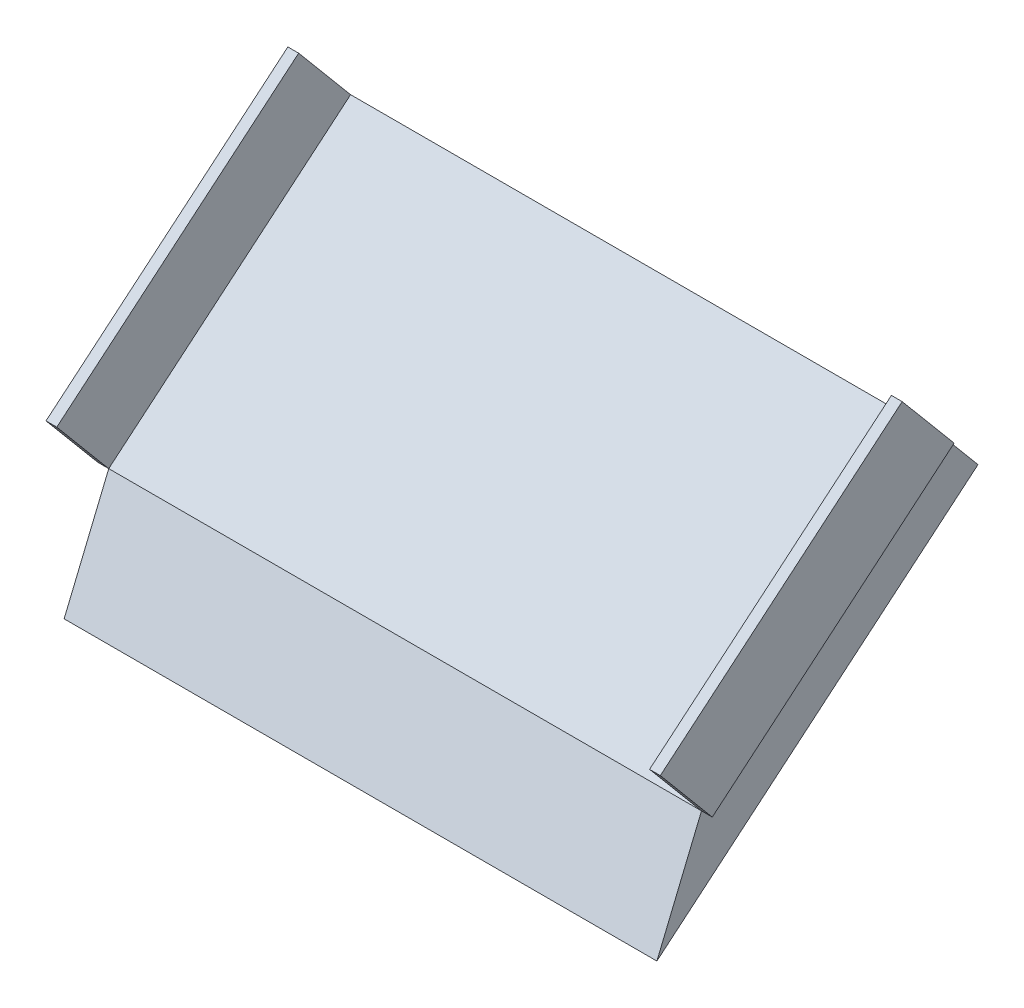
ISO-10303-21;
HEADER;
FILE_DESCRIPTION(('STEP AP214'),'2;1');
FILE_NAME('part.step','',(''),(''),'','','');
FILE_SCHEMA(('AUTOMOTIVE_DESIGN { 1 0 10303 214 1 1 1 1 }'));
ENDSEC;
DATA;
#1=APPLICATION_CONTEXT('core data for automotive mechanical design processes');
#2=APPLICATION_PROTOCOL_DEFINITION('international standard','automotive_design',2000,#1);
#3=PRODUCT_CONTEXT('',#1,'mechanical');
#4=PRODUCT('Part','Part','',(#3));
#5=PRODUCT_RELATED_PRODUCT_CATEGORY('part','',(#4));
#6=PRODUCT_DEFINITION_FORMATION('','',#4);
#7=PRODUCT_DEFINITION_CONTEXT('part definition',#1,'design');
#8=PRODUCT_DEFINITION('design','',#6,#7);
#9=PRODUCT_DEFINITION_SHAPE('','',#8);
#10=(LENGTH_UNIT() NAMED_UNIT(*) SI_UNIT(.MILLI.,.METRE.));
#11=(NAMED_UNIT(*) PLANE_ANGLE_UNIT() SI_UNIT($,.RADIAN.));
#12=(NAMED_UNIT(*) SI_UNIT($,.STERADIAN.) SOLID_ANGLE_UNIT());
#13=UNCERTAINTY_MEASURE_WITH_UNIT(LENGTH_MEASURE(1.E-05),#10,'distance_accuracy_value','');
#14=(GEOMETRIC_REPRESENTATION_CONTEXT(3) GLOBAL_UNCERTAINTY_ASSIGNED_CONTEXT((#13)) GLOBAL_UNIT_ASSIGNED_CONTEXT((#10,
#11,#12)) REPRESENTATION_CONTEXT('',''));
#15=CARTESIAN_POINT('',(0.,0.,0.));
#16=DIRECTION('',(0.,0.,1.));
#17=DIRECTION('',(1.,0.,0.));
#18=AXIS2_PLACEMENT_3D('',#15,#16,#17);
#19=CARTESIAN_POINT('',(-20.,-300.,513.09846046431));
#20=DIRECTION('',(0.,0.766044443118982,0.642787609686535));
#21=DIRECTION('',(0.,-0.642787609686535,0.766044443118982));
#22=AXIS2_PLACEMENT_3D('',#19,#20,#21);
#23=PLANE('',#22);
#24=DIRECTION('',(0.,-0.642787609686535,0.766044443118982));
#25=VECTOR('',#24,1.);
#26=CARTESIAN_POINT('',(0.,-300.,513.09846046431));
#27=LINE('',#26,#25);
#28=CARTESIAN_POINT('',(0.,76.6044443118982,64.2787609686535));
#29=VERTEX_POINT('',#28);
#30=CARTESIAN_POINT('',(0.,-300.,513.09846046431));
#31=VERTEX_POINT('',#30);
#32=EDGE_CURVE('E109',#29,#31,#27,.T.);
#33=ORIENTED_EDGE('',*,*,#32,.T.);
#34=DIRECTION('',(1.,0.,0.));
#35=VECTOR('',#34,1.);
#36=CARTESIAN_POINT('',(-20.,-300.,513.09846046431));
#37=LINE('',#36,#35);
#38=CARTESIAN_POINT('',(-20.,-300.,513.09846046431));
#39=VERTEX_POINT('',#38);
#40=EDGE_CURVE('E12',#39,#31,#37,.T.);
#41=ORIENTED_EDGE('',*,*,#40,.F.);
#42=DIRECTION('',(0.,-0.642787609686535,0.766044443118982));
#43=VECTOR('',#42,1.);
#44=CARTESIAN_POINT('',(-20.,-300.,513.09846046431));
#45=LINE('',#44,#43);
#46=CARTESIAN_POINT('',(-20.,76.6044443118982,64.2787609686535));
#47=VERTEX_POINT('',#46);
#48=EDGE_CURVE('E97',#47,#39,#45,.T.);
#49=ORIENTED_EDGE('',*,*,#48,.F.);
#50=DIRECTION('',(1.,0.,0.));
#51=VECTOR('',#50,1.);
#52=CARTESIAN_POINT('',(-20.,76.6044443118982,64.2787609686535));
#53=LINE('',#52,#51);
#54=EDGE_CURVE('E105',#47,#29,#53,.T.);
#55=ORIENTED_EDGE('',*,*,#54,.T.);
#56=EDGE_LOOP('',(#33,#41,#49,#55));
#57=FACE_BOUND('',#56,.T.);
#58=ADVANCED_FACE('F46',(#57),#23,.F.);
#59=CARTESIAN_POINT('',(-20.,-185.093333532153,609.51660191729));
#60=DIRECTION('',(0.,0.642787609686535,-0.766044443118981));
#61=DIRECTION('',(0.,0.766044443118981,0.642787609686536));
#62=AXIS2_PLACEMENT_3D('',#59,#60,#61);
#63=PLANE('',#62);
#64=DIRECTION('',(0.,0.766044443118981,0.642787609686535));
#65=VECTOR('',#64,1.);
#66=CARTESIAN_POINT('',(0.,-185.093333532153,609.51660191729));
#67=LINE('',#66,#65);
#68=CARTESIAN_POINT('',(0.,-185.093333532153,609.51660191729));
#69=VERTEX_POINT('',#68);
#70=EDGE_CURVE('E101',#31,#69,#67,.T.);
#71=ORIENTED_EDGE('',*,*,#70,.T.);
#72=DIRECTION('',(1.,0.,0.));
#73=VECTOR('',#72,1.);
#74=CARTESIAN_POINT('',(-20.,-185.093333532153,609.51660191729));
#75=LINE('',#74,#73);
#76=CARTESIAN_POINT('',(-20.,-185.093333532153,609.51660191729));
#77=VERTEX_POINT('',#76);
#78=EDGE_CURVE('E54',#77,#69,#75,.T.);
#79=ORIENTED_EDGE('',*,*,#78,.F.);
#80=DIRECTION('',(0.,0.766044443118981,0.642787609686535));
#81=VECTOR('',#80,1.);
#82=CARTESIAN_POINT('',(-20.,-185.093333532153,609.51660191729));
#83=LINE('',#82,#81);
#84=EDGE_CURVE('E92',#39,#77,#83,.T.);
#85=ORIENTED_EDGE('',*,*,#84,.F.);
#86=ORIENTED_EDGE('',*,*,#40,.T.);
#87=EDGE_LOOP('',(#71,#79,#85,#86));
#88=FACE_BOUND('',#87,.T.);
#89=ADVANCED_FACE('F100',(#88),#63,.F.);
#90=CARTESIAN_POINT('',(-20.,191.511110779745,160.696902421634));
#91=DIRECTION('',(0.,-0.766044443118981,-0.642787609686536));
#92=DIRECTION('',(0.,0.642787609686536,-0.766044443118981));
#93=AXIS2_PLACEMENT_3D('',#90,#91,#92);
#94=PLANE('',#93);
#95=DIRECTION('',(0.,0.642787609686536,-0.766044443118981));
#96=VECTOR('',#95,1.);
#97=CARTESIAN_POINT('',(0.,191.511110779745,160.696902421634));
#98=LINE('',#97,#96);
#99=CARTESIAN_POINT('',(0.,191.511110779745,160.696902421634));
#100=VERTEX_POINT('',#99);
#101=EDGE_CURVE('E79',#69,#100,#98,.T.);
#102=ORIENTED_EDGE('',*,*,#101,.T.);
#103=DIRECTION('',(1.,0.,0.));
#104=VECTOR('',#103,1.);
#105=CARTESIAN_POINT('',(-20.,191.511110779745,160.696902421634));
#106=LINE('',#105,#104);
#107=CARTESIAN_POINT('',(-20.,191.511110779745,160.696902421634));
#108=VERTEX_POINT('',#107);
#109=EDGE_CURVE('E102',#108,#100,#106,.T.);
#110=ORIENTED_EDGE('',*,*,#109,.F.);
#111=DIRECTION('',(0.,0.642787609686536,-0.766044443118981));
#112=VECTOR('',#111,1.);
#113=CARTESIAN_POINT('',(-20.,191.511110779745,160.696902421634));
#114=LINE('',#113,#112);
#115=EDGE_CURVE('E95',#77,#108,#114,.T.);
#116=ORIENTED_EDGE('',*,*,#115,.F.);
#117=ORIENTED_EDGE('',*,*,#78,.T.);
#118=EDGE_LOOP('',(#102,#110,#116,#117));
#119=FACE_BOUND('',#118,.T.);
#120=ADVANCED_FACE('F103',(#119),#94,.F.);
#121=CARTESIAN_POINT('',(-20.,76.6044443118982,64.2787609686535));
#122=DIRECTION('',(0.,-0.642787609686536,0.766044443118981));
#123=DIRECTION('',(0.,-0.766044443118981,-0.642787609686536));
#124=AXIS2_PLACEMENT_3D('',#121,#122,#123);
#125=PLANE('',#124);
#126=DIRECTION('',(0.,-0.766044443118981,-0.642787609686536));
#127=VECTOR('',#126,1.);
#128=CARTESIAN_POINT('',(0.,76.6044443118982,64.2787609686535));
#129=LINE('',#128,#127);
#130=EDGE_CURVE('E85',#100,#29,#129,.T.);
#131=ORIENTED_EDGE('',*,*,#130,.T.);
#132=ORIENTED_EDGE('',*,*,#54,.F.);
#133=DIRECTION('',(0.,-0.766044443118981,-0.642787609686536));
#134=VECTOR('',#133,1.);
#135=CARTESIAN_POINT('',(-20.,76.6044443118982,64.2787609686535));
#136=LINE('',#135,#134);
#137=EDGE_CURVE('E62',#108,#47,#136,.T.);
#138=ORIENTED_EDGE('',*,*,#137,.F.);
#139=ORIENTED_EDGE('',*,*,#109,.T.);
#140=EDGE_LOOP('',(#131,#132,#138,#139));
#141=FACE_BOUND('',#140,.T.);
#142=ADVANCED_FACE('F116',(#141),#125,.F.);
#143=CARTESIAN_POINT('',(-20.,0.,0.));
#144=DIRECTION('',(1.,0.,0.));
#145=DIRECTION('',(0.,0.,-1.));
#146=AXIS2_PLACEMENT_3D('',#143,#144,#145);
#147=PLANE('',#146);
#148=ORIENTED_EDGE('',*,*,#48,.T.);
#149=ORIENTED_EDGE('',*,*,#84,.T.);
#150=ORIENTED_EDGE('',*,*,#115,.T.);
#151=ORIENTED_EDGE('',*,*,#137,.T.);
#152=EDGE_LOOP('',(#148,#149,#150,#151));
#153=FACE_BOUND('',#152,.T.);
#154=ADVANCED_FACE('F93',(#153),#147,.F.);
#155=CARTESIAN_POINT('',(0.,0.,0.));
#156=DIRECTION('',(1.,0.,0.));
#157=DIRECTION('',(0.,0.,-1.));
#158=AXIS2_PLACEMENT_3D('',#155,#156,#157);
#159=PLANE('',#158);
#160=ORIENTED_EDGE('',*,*,#32,.F.);
#161=ORIENTED_EDGE('',*,*,#130,.F.);
#162=ORIENTED_EDGE('',*,*,#101,.F.);
#163=ORIENTED_EDGE('',*,*,#70,.F.);
#164=EDGE_LOOP('',(#160,#161,#162,#163));
#165=FACE_BOUND('',#164,.T.);
#166=ADVANCED_FACE('F119',(#165),#159,.T.);
#167=CLOSED_SHELL('',(#58,#89,#120,#142,#154,#166));
#168=MANIFOLD_SOLID_BREP('B2',#167);
#169=CARTESIAN_POINT('',(1120.,-300.,513.09846046431));
#170=DIRECTION('',(0.,0.766044443118982,0.642787609686535));
#171=DIRECTION('',(0.,-0.642787609686535,0.766044443118982));
#172=AXIS2_PLACEMENT_3D('',#169,#170,#171);
#173=PLANE('',#172);
#174=DIRECTION('',(0.,0.642787609686535,-0.766044443118982));
#175=VECTOR('',#174,1.);
#176=CARTESIAN_POINT('',(1100.,-300.,513.09846046431));
#177=LINE('',#176,#175);
#178=CARTESIAN_POINT('',(1100.,-300.,513.09846046431));
#179=VERTEX_POINT('',#178);
#180=CARTESIAN_POINT('',(1100.,76.6044443118982,64.2787609686535));
#181=VERTEX_POINT('',#180);
#182=EDGE_CURVE('E242',#179,#181,#177,.T.);
#183=ORIENTED_EDGE('',*,*,#182,.T.);
#184=DIRECTION('',(-1.,0.,0.));
#185=VECTOR('',#184,1.);
#186=CARTESIAN_POINT('',(1120.,76.6044443118982,64.2787609686535));
#187=LINE('',#186,#185);
#188=CARTESIAN_POINT('',(1120.,76.6044443118982,64.2787609686535));
#189=VERTEX_POINT('',#188);
#190=EDGE_CURVE('E44',#189,#181,#187,.T.);
#191=ORIENTED_EDGE('',*,*,#190,.F.);
#192=DIRECTION('',(0.,0.642787609686535,-0.766044443118982));
#193=VECTOR('',#192,1.);
#194=CARTESIAN_POINT('',(1120.,-300.,513.09846046431));
#195=LINE('',#194,#193);
#196=CARTESIAN_POINT('',(1120.,-300.,513.09846046431));
#197=VERTEX_POINT('',#196);
#198=EDGE_CURVE('E230',#197,#189,#195,.T.);
#199=ORIENTED_EDGE('',*,*,#198,.F.);
#200=DIRECTION('',(-1.,0.,0.));
#201=VECTOR('',#200,1.);
#202=CARTESIAN_POINT('',(1120.,-300.,513.09846046431));
#203=LINE('',#202,#201);
#204=EDGE_CURVE('E238',#197,#179,#203,.T.);
#205=ORIENTED_EDGE('',*,*,#204,.T.);
#206=EDGE_LOOP('',(#183,#191,#199,#205));
#207=FACE_BOUND('',#206,.T.);
#208=ADVANCED_FACE('F179',(#207),#173,.F.);
#209=CARTESIAN_POINT('',(1120.,76.6044443118982,64.2787609686535));
#210=DIRECTION('',(0.,-0.642787609686536,0.766044443118981));
#211=DIRECTION('',(0.,-0.766044443118981,-0.642787609686536));
#212=AXIS2_PLACEMENT_3D('',#209,#210,#211);
#213=PLANE('',#212);
#214=DIRECTION('',(0.,0.766044443118981,0.642787609686536));
#215=VECTOR('',#214,1.);
#216=CARTESIAN_POINT('',(1100.,76.6044443118982,64.2787609686535));
#217=LINE('',#216,#215);
#218=CARTESIAN_POINT('',(1100.,191.511110779745,160.696902421634));
#219=VERTEX_POINT('',#218);
#220=EDGE_CURVE('E234',#181,#219,#217,.T.);
#221=ORIENTED_EDGE('',*,*,#220,.T.);
#222=DIRECTION('',(-1.,0.,0.));
#223=VECTOR('',#222,1.);
#224=CARTESIAN_POINT('',(1120.,191.511110779745,160.696902421634));
#225=LINE('',#224,#223);
#226=CARTESIAN_POINT('',(1120.,191.511110779745,160.696902421634));
#227=VERTEX_POINT('',#226);
#228=EDGE_CURVE('E187',#227,#219,#225,.T.);
#229=ORIENTED_EDGE('',*,*,#228,.F.);
#230=DIRECTION('',(0.,0.766044443118981,0.642787609686536));
#231=VECTOR('',#230,1.);
#232=CARTESIAN_POINT('',(1120.,76.6044443118982,64.2787609686535));
#233=LINE('',#232,#231);
#234=EDGE_CURVE('E225',#189,#227,#233,.T.);
#235=ORIENTED_EDGE('',*,*,#234,.F.);
#236=ORIENTED_EDGE('',*,*,#190,.T.);
#237=EDGE_LOOP('',(#221,#229,#235,#236));
#238=FACE_BOUND('',#237,.T.);
#239=ADVANCED_FACE('F233',(#238),#213,.F.);
#240=CARTESIAN_POINT('',(1120.,191.511110779745,160.696902421634));
#241=DIRECTION('',(0.,-0.766044443118981,-0.642787609686536));
#242=DIRECTION('',(0.,0.642787609686536,-0.766044443118981));
#243=AXIS2_PLACEMENT_3D('',#240,#241,#242);
#244=PLANE('',#243);
#245=DIRECTION('',(0.,-0.642787609686536,0.766044443118981));
#246=VECTOR('',#245,1.);
#247=CARTESIAN_POINT('',(1100.,191.511110779745,160.696902421634));
#248=LINE('',#247,#246);
#249=CARTESIAN_POINT('',(1100.,-185.093333532153,609.51660191729));
#250=VERTEX_POINT('',#249);
#251=EDGE_CURVE('E212',#219,#250,#248,.T.);
#252=ORIENTED_EDGE('',*,*,#251,.T.);
#253=DIRECTION('',(-1.,0.,0.));
#254=VECTOR('',#253,1.);
#255=CARTESIAN_POINT('',(1120.,-185.093333532153,609.51660191729));
#256=LINE('',#255,#254);
#257=CARTESIAN_POINT('',(1120.,-185.093333532153,609.51660191729));
#258=VERTEX_POINT('',#257);
#259=EDGE_CURVE('E235',#258,#250,#256,.T.);
#260=ORIENTED_EDGE('',*,*,#259,.F.);
#261=DIRECTION('',(0.,-0.642787609686536,0.766044443118981));
#262=VECTOR('',#261,1.);
#263=CARTESIAN_POINT('',(1120.,191.511110779745,160.696902421634));
#264=LINE('',#263,#262);
#265=EDGE_CURVE('E228',#227,#258,#264,.T.);
#266=ORIENTED_EDGE('',*,*,#265,.F.);
#267=ORIENTED_EDGE('',*,*,#228,.T.);
#268=EDGE_LOOP('',(#252,#260,#266,#267));
#269=FACE_BOUND('',#268,.T.);
#270=ADVANCED_FACE('F236',(#269),#244,.F.);
#271=CARTESIAN_POINT('',(1120.,-185.093333532153,609.51660191729));
#272=DIRECTION('',(0.,0.642787609686535,-0.766044443118981));
#273=DIRECTION('',(0.,0.766044443118981,0.642787609686536));
#274=AXIS2_PLACEMENT_3D('',#271,#272,#273);
#275=PLANE('',#274);
#276=DIRECTION('',(0.,-0.766044443118981,-0.642787609686535));
#277=VECTOR('',#276,1.);
#278=CARTESIAN_POINT('',(1100.,-185.093333532153,609.51660191729));
#279=LINE('',#278,#277);
#280=EDGE_CURVE('E218',#250,#179,#279,.T.);
#281=ORIENTED_EDGE('',*,*,#280,.T.);
#282=ORIENTED_EDGE('',*,*,#204,.F.);
#283=DIRECTION('',(0.,-0.766044443118981,-0.642787609686535));
#284=VECTOR('',#283,1.);
#285=CARTESIAN_POINT('',(1120.,-185.093333532153,609.51660191729));
#286=LINE('',#285,#284);
#287=EDGE_CURVE('E195',#258,#197,#286,.T.);
#288=ORIENTED_EDGE('',*,*,#287,.F.);
#289=ORIENTED_EDGE('',*,*,#259,.T.);
#290=EDGE_LOOP('',(#281,#282,#288,#289));
#291=FACE_BOUND('',#290,.T.);
#292=ADVANCED_FACE('F249',(#291),#275,.F.);
#293=CARTESIAN_POINT('',(1120.,0.,0.));
#294=DIRECTION('',(1.,0.,0.));
#295=DIRECTION('',(0.,0.,-1.));
#296=AXIS2_PLACEMENT_3D('',#293,#294,#295);
#297=PLANE('',#296);
#298=ORIENTED_EDGE('',*,*,#198,.T.);
#299=ORIENTED_EDGE('',*,*,#234,.T.);
#300=ORIENTED_EDGE('',*,*,#265,.T.);
#301=ORIENTED_EDGE('',*,*,#287,.T.);
#302=EDGE_LOOP('',(#298,#299,#300,#301));
#303=FACE_BOUND('',#302,.T.);
#304=ADVANCED_FACE('F226',(#303),#297,.T.);
#305=CARTESIAN_POINT('',(1100.,0.,0.));
#306=DIRECTION('',(1.,0.,0.));
#307=DIRECTION('',(0.,0.,-1.));
#308=AXIS2_PLACEMENT_3D('',#305,#306,#307);
#309=PLANE('',#308);
#310=ORIENTED_EDGE('',*,*,#182,.F.);
#311=ORIENTED_EDGE('',*,*,#280,.F.);
#312=ORIENTED_EDGE('',*,*,#251,.F.);
#313=ORIENTED_EDGE('',*,*,#220,.F.);
#314=EDGE_LOOP('',(#310,#311,#312,#313));
#315=FACE_BOUND('',#314,.T.);
#316=ADVANCED_FACE('F252',(#315),#309,.F.);
#317=CLOSED_SHELL('',(#208,#239,#270,#292,#304,#316));
#318=MANIFOLD_SOLID_BREP('B6',#317);
#319=CARTESIAN_POINT('',(1100.,76.6044443118982,64.2787609686535));
#320=DIRECTION('',(0.,-0.766044443118982,-0.642787609686535));
#321=DIRECTION('',(0.,0.642787609686535,-0.766044443118982));
#322=AXIS2_PLACEMENT_3D('',#319,#320,#321);
#323=PLANE('',#322);
#324=DIRECTION('',(0.,-0.642787609686535,0.766044443118982));
#325=VECTOR('',#324,1.);
#326=CARTESIAN_POINT('',(0.,76.6044443118982,64.2787609686535));
#327=LINE('',#326,#325);
#328=CARTESIAN_POINT('',(0.,76.6044443118982,64.2787609686535));
#329=VERTEX_POINT('',#328);
#330=CARTESIAN_POINT('',(0.,-300.,513.09846046431));
#331=VERTEX_POINT('',#330);
#332=EDGE_CURVE('E365',#329,#331,#327,.T.);
#333=ORIENTED_EDGE('',*,*,#332,.T.);
#334=DIRECTION('',(-1.,0.,0.));
#335=VECTOR('',#334,1.);
#336=CARTESIAN_POINT('',(1100.,-300.,513.09846046431));
#337=LINE('',#336,#335);
#338=CARTESIAN_POINT('',(1100.,-300.,513.09846046431));
#339=VERTEX_POINT('',#338);
#340=EDGE_CURVE('E177',#339,#331,#337,.T.);
#341=ORIENTED_EDGE('',*,*,#340,.F.);
#342=DIRECTION('',(0.,-0.642787609686535,0.766044443118982));
#343=VECTOR('',#342,1.);
#344=CARTESIAN_POINT('',(1100.,76.6044443118982,64.2787609686535));
#345=LINE('',#344,#343);
#346=CARTESIAN_POINT('',(1100.,76.6044443118982,64.2787609686535));
#347=VERTEX_POINT('',#346);
#348=EDGE_CURVE('E350',#347,#339,#345,.T.);
#349=ORIENTED_EDGE('',*,*,#348,.F.);
#350=DIRECTION('',(-1.,0.,0.));
#351=VECTOR('',#350,1.);
#352=CARTESIAN_POINT('',(1100.,76.6044443118982,64.2787609686535));
#353=LINE('',#352,#351);
#354=EDGE_CURVE('E361',#347,#329,#353,.T.);
#355=ORIENTED_EDGE('',*,*,#354,.T.);
#356=EDGE_LOOP('',(#333,#341,#349,#355));
#357=FACE_BOUND('',#356,.T.);
#358=ADVANCED_FACE('F303',(#357),#323,.F.);
#359=CARTESIAN_POINT('',(1100.,137.432270038171,332.048883697686));
#360=DIRECTION('',(0.,-0.382429558213705,-0.923984649766689));
#361=DIRECTION('',(0.,0.923984649766689,-0.382429558213705));
#362=AXIS2_PLACEMENT_3D('',#359,#360,#361);
#363=PLANE('',#362);
#364=DIRECTION('',(0.,-0.923984649766689,0.382429558213705));
#365=VECTOR('',#364,1.);
#366=CARTESIAN_POINT('',(0.,137.432270038171,332.048883697686));
#367=LINE('',#366,#365);
#368=CARTESIAN_POINT('',(0.,-500.,595.876796297112));
#369=VERTEX_POINT('',#368);
#370=EDGE_CURVE('E355',#331,#369,#367,.T.);
#371=ORIENTED_EDGE('',*,*,#370,.T.);
#372=DIRECTION('',(-1.,0.,0.));
#373=VECTOR('',#372,1.);
#374=CARTESIAN_POINT('',(1100.,-500.,595.876796297112));
#375=LINE('',#374,#373);
#376=CARTESIAN_POINT('',(1100.,-500.,595.876796297112));
#377=VERTEX_POINT('',#376);
#378=EDGE_CURVE('E311',#377,#369,#375,.T.);
#379=ORIENTED_EDGE('',*,*,#378,.F.);
#380=DIRECTION('',(0.,-0.923984649766689,0.382429558213705));
#381=VECTOR('',#380,1.);
#382=CARTESIAN_POINT('',(1100.,137.432270038171,332.048883697686));
#383=LINE('',#382,#381);
#384=EDGE_CURVE('E345',#339,#377,#383,.T.);
#385=ORIENTED_EDGE('',*,*,#384,.F.);
#386=ORIENTED_EDGE('',*,*,#340,.T.);
#387=EDGE_LOOP('',(#371,#379,#385,#386));
#388=FACE_BOUND('',#387,.T.);
#389=ADVANCED_FACE('F354',(#388),#363,.F.);
#390=CARTESIAN_POINT('',(1100.,3.61454075920661E-13,3.03295981792548E-13));
#391=DIRECTION('',(0.,-0.766044443118981,-0.642787609686536));
#392=DIRECTION('',(0.,0.642787609686536,-0.766044443118981));
#393=AXIS2_PLACEMENT_3D('',#390,#391,#392);
#394=PLANE('',#393);
#395=DIRECTION('',(0.,-0.642787609686536,0.766044443118981));
#396=VECTOR('',#395,1.);
#397=CARTESIAN_POINT('',(0.,3.61454075920661E-13,3.03295981792548E-13));
#398=LINE('',#397,#396);
#399=CARTESIAN_POINT('',(0.,0.,0.));
#400=VERTEX_POINT('',#399);
#401=EDGE_CURVE('E369',#400,#369,#398,.T.);
#402=ORIENTED_EDGE('',*,*,#401,.F.);
#403=DIRECTION('',(-1.,0.,0.));
#404=VECTOR('',#403,1.);
#405=CARTESIAN_POINT('',(1100.,0.,0.));
#406=LINE('',#405,#404);
#407=CARTESIAN_POINT('',(1100.,0.,0.));
#408=VERTEX_POINT('',#407);
#409=EDGE_CURVE('E335',#408,#400,#406,.T.);
#410=ORIENTED_EDGE('',*,*,#409,.F.);
#411=DIRECTION('',(0.,-0.642787609686536,0.766044443118981));
#412=VECTOR('',#411,1.);
#413=CARTESIAN_POINT('',(1100.,3.61454075920661E-13,3.03295981792548E-13));
#414=LINE('',#413,#412);
#415=EDGE_CURVE('E348',#408,#377,#414,.T.);
#416=ORIENTED_EDGE('',*,*,#415,.T.);
#417=ORIENTED_EDGE('',*,*,#378,.T.);
#418=EDGE_LOOP('',(#402,#410,#416,#417));
#419=FACE_BOUND('',#418,.T.);
#420=ADVANCED_FACE('F359',(#419),#394,.T.);
#421=CARTESIAN_POINT('',(1100.,0.,0.));
#422=DIRECTION('',(0.,-0.642787609686535,0.766044443118982));
#423=DIRECTION('',(0.,-0.766044443118982,-0.642787609686535));
#424=AXIS2_PLACEMENT_3D('',#421,#422,#423);
#425=PLANE('',#424);
#426=DIRECTION('',(0.,0.766044443118982,0.642787609686535));
#427=VECTOR('',#426,1.);
#428=CARTESIAN_POINT('',(0.,0.,0.));
#429=LINE('',#428,#427);
#430=EDGE_CURVE('E338',#400,#329,#429,.T.);
#431=ORIENTED_EDGE('',*,*,#430,.T.);
#432=ORIENTED_EDGE('',*,*,#354,.F.);
#433=DIRECTION('',(0.,0.766044443118982,0.642787609686535));
#434=VECTOR('',#433,1.);
#435=CARTESIAN_POINT('',(1100.,0.,0.));
#436=LINE('',#435,#434);
#437=EDGE_CURVE('E319',#408,#347,#436,.T.);
#438=ORIENTED_EDGE('',*,*,#437,.F.);
#439=ORIENTED_EDGE('',*,*,#409,.T.);
#440=EDGE_LOOP('',(#431,#432,#438,#439));
#441=FACE_BOUND('',#440,.T.);
#442=ADVANCED_FACE('F382',(#441),#425,.F.);
#443=CARTESIAN_POINT('',(1100.,0.,0.));
#444=DIRECTION('',(1.,0.,0.));
#445=DIRECTION('',(0.,0.,-1.));
#446=AXIS2_PLACEMENT_3D('',#443,#444,#445);
#447=PLANE('',#446);
#448=ORIENTED_EDGE('',*,*,#348,.T.);
#449=ORIENTED_EDGE('',*,*,#384,.T.);
#450=ORIENTED_EDGE('',*,*,#415,.F.);
#451=ORIENTED_EDGE('',*,*,#437,.T.);
#452=EDGE_LOOP('',(#448,#449,#450,#451));
#453=FACE_BOUND('',#452,.T.);
#454=ADVANCED_FACE('F346',(#453),#447,.T.);
#455=CARTESIAN_POINT('',(0.,0.,0.));
#456=DIRECTION('',(1.,0.,0.));
#457=DIRECTION('',(0.,0.,-1.));
#458=AXIS2_PLACEMENT_3D('',#455,#456,#457);
#459=PLANE('',#458);
#460=ORIENTED_EDGE('',*,*,#332,.F.);
#461=ORIENTED_EDGE('',*,*,#430,.F.);
#462=ORIENTED_EDGE('',*,*,#401,.T.);
#463=ORIENTED_EDGE('',*,*,#370,.F.);
#464=EDGE_LOOP('',(#460,#461,#462,#463));
#465=FACE_BOUND('',#464,.T.);
#466=ADVANCED_FACE('F376',(#465),#459,.F.);
#467=CLOSED_SHELL('',(#358,#389,#420,#442,#454,#466));
#468=MANIFOLD_SOLID_BREP('B38',#467);
#469=ADVANCED_BREP_SHAPE_REPRESENTATION('',(#18,#168,#318,#468),#14);
#470=SHAPE_DEFINITION_REPRESENTATION(#9,#469);
ENDSEC;
END-ISO-10303-21;
